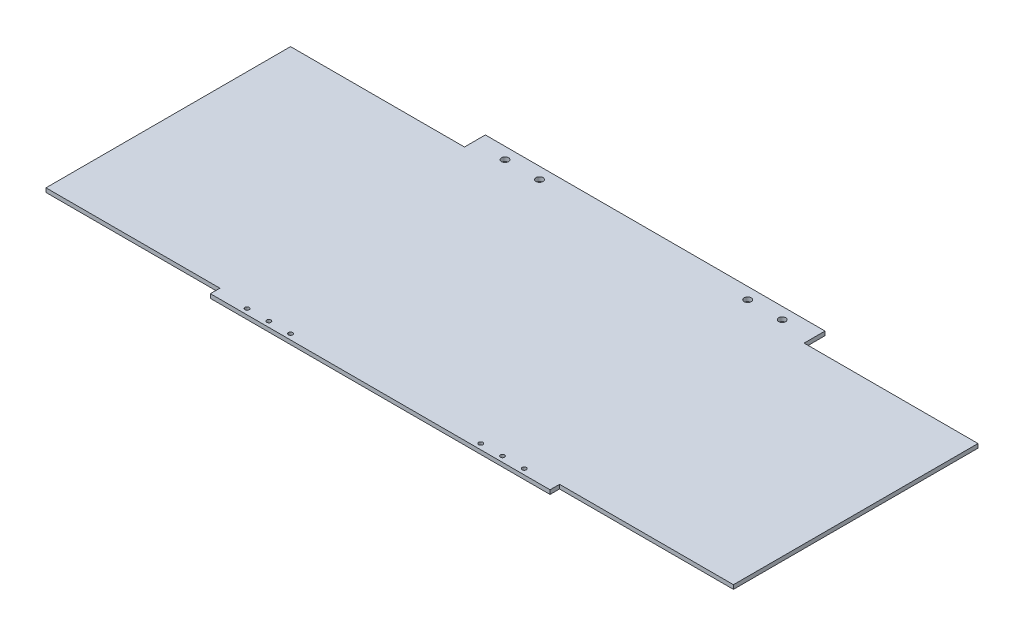
ISO-10303-21;
HEADER;
FILE_DESCRIPTION(('STEP AP214'),'2;1');
FILE_NAME('part.step','',(''),(''),'','','');
FILE_SCHEMA(('AUTOMOTIVE_DESIGN { 1 0 10303 214 1 1 1 1 }'));
ENDSEC;
DATA;
#1=APPLICATION_CONTEXT('core data for automotive mechanical design processes');
#2=APPLICATION_PROTOCOL_DEFINITION('international standard','automotive_design',2000,#1);
#3=PRODUCT_CONTEXT('',#1,'mechanical');
#4=PRODUCT('Part','Part','',(#3));
#5=PRODUCT_RELATED_PRODUCT_CATEGORY('part','',(#4));
#6=PRODUCT_DEFINITION_FORMATION('','',#4);
#7=PRODUCT_DEFINITION_CONTEXT('part definition',#1,'design');
#8=PRODUCT_DEFINITION('design','',#6,#7);
#9=PRODUCT_DEFINITION_SHAPE('','',#8);
#10=(LENGTH_UNIT() NAMED_UNIT(*) SI_UNIT(.MILLI.,.METRE.));
#11=(NAMED_UNIT(*) PLANE_ANGLE_UNIT() SI_UNIT($,.RADIAN.));
#12=(NAMED_UNIT(*) SI_UNIT($,.STERADIAN.) SOLID_ANGLE_UNIT());
#13=UNCERTAINTY_MEASURE_WITH_UNIT(LENGTH_MEASURE(1.E-05),#10,'distance_accuracy_value','');
#14=(GEOMETRIC_REPRESENTATION_CONTEXT(3) GLOBAL_UNCERTAINTY_ASSIGNED_CONTEXT((#13)) GLOBAL_UNIT_ASSIGNED_CONTEXT((#10,
#11,#12)) REPRESENTATION_CONTEXT('',''));
#15=CARTESIAN_POINT('',(0.,0.,0.));
#16=DIRECTION('',(0.,0.,1.));
#17=DIRECTION('',(1.,0.,0.));
#18=AXIS2_PLACEMENT_3D('',#15,#16,#17);
#19=CARTESIAN_POINT('',(0.,3.,0.));
#20=DIRECTION('',(0.,-1.,0.));
#21=DIRECTION('',(0.,0.,-1.));
#22=AXIS2_PLACEMENT_3D('',#19,#20,#21);
#23=PLANE('',#22);
#24=DIRECTION('',(0.,0.,1.));
#25=VECTOR('',#24,1.);
#26=CARTESIAN_POINT('',(0.,3.,0.));
#27=LINE('',#26,#25);
#28=CARTESIAN_POINT('',(0.,3.,-180.));
#29=VERTEX_POINT('',#28);
#30=CARTESIAN_POINT('',(0.,3.,0.));
#31=VERTEX_POINT('',#30);
#32=EDGE_CURVE('E187',#29,#31,#27,.T.);
#33=ORIENTED_EDGE('',*,*,#32,.T.);
#34=DIRECTION('',(1.,0.,0.));
#35=VECTOR('',#34,1.);
#36=CARTESIAN_POINT('',(0.,3.,0.));
#37=LINE('',#36,#35);
#38=CARTESIAN_POINT('',(128.,3.,0.));
#39=VERTEX_POINT('',#38);
#40=EDGE_CURVE('E115',#31,#39,#37,.T.);
#41=ORIENTED_EDGE('',*,*,#40,.T.);
#42=DIRECTION('',(0.,0.,1.));
#43=VECTOR('',#42,1.);
#44=CARTESIAN_POINT('',(128.,3.,0.));
#45=LINE('',#44,#43);
#46=CARTESIAN_POINT('',(128.,3.,7.));
#47=VERTEX_POINT('',#46);
#48=EDGE_CURVE('E214',#39,#47,#45,.T.);
#49=ORIENTED_EDGE('',*,*,#48,.T.);
#50=DIRECTION('',(1.,0.,0.));
#51=VECTOR('',#50,1.);
#52=CARTESIAN_POINT('',(128.,3.,7.));
#53=LINE('',#52,#51);
#54=CARTESIAN_POINT('',(378.,3.,7.));
#55=VERTEX_POINT('',#54);
#56=EDGE_CURVE('E233',#47,#55,#53,.T.);
#57=ORIENTED_EDGE('',*,*,#56,.T.);
#58=DIRECTION('',(0.,0.,-1.));
#59=VECTOR('',#58,1.);
#60=CARTESIAN_POINT('',(378.,3.,7.));
#61=LINE('',#60,#59);
#62=CARTESIAN_POINT('',(378.,3.,0.));
#63=VERTEX_POINT('',#62);
#64=EDGE_CURVE('E230',#55,#63,#61,.T.);
#65=ORIENTED_EDGE('',*,*,#64,.T.);
#66=DIRECTION('',(1.,0.,0.));
#67=VECTOR('',#66,1.);
#68=CARTESIAN_POINT('',(378.,3.,0.));
#69=LINE('',#68,#67);
#70=CARTESIAN_POINT('',(506.,3.,0.));
#71=VERTEX_POINT('',#70);
#72=EDGE_CURVE('E232',#63,#71,#69,.T.);
#73=ORIENTED_EDGE('',*,*,#72,.T.);
#74=DIRECTION('',(0.,0.,-1.));
#75=VECTOR('',#74,1.);
#76=CARTESIAN_POINT('',(506.,3.,0.));
#77=LINE('',#76,#75);
#78=CARTESIAN_POINT('',(506.,3.,-180.));
#79=VERTEX_POINT('',#78);
#80=EDGE_CURVE('E235',#71,#79,#77,.T.);
#81=ORIENTED_EDGE('',*,*,#80,.T.);
#82=DIRECTION('',(-1.,0.,0.));
#83=VECTOR('',#82,1.);
#84=CARTESIAN_POINT('',(378.,3.,-180.));
#85=LINE('',#84,#83);
#86=CARTESIAN_POINT('',(378.,3.,-180.));
#87=VERTEX_POINT('',#86);
#88=EDGE_CURVE('E241',#79,#87,#85,.T.);
#89=ORIENTED_EDGE('',*,*,#88,.T.);
#90=DIRECTION('',(0.,0.,-1.));
#91=VECTOR('',#90,1.);
#92=CARTESIAN_POINT('',(378.,3.,-195.398));
#93=LINE('',#92,#91);
#94=CARTESIAN_POINT('',(378.,3.,-195.398));
#95=VERTEX_POINT('',#94);
#96=EDGE_CURVE('E146',#87,#95,#93,.T.);
#97=ORIENTED_EDGE('',*,*,#96,.T.);
#98=DIRECTION('',(-1.,0.,0.));
#99=VECTOR('',#98,1.);
#100=CARTESIAN_POINT('',(128.,3.,-195.398));
#101=LINE('',#100,#99);
#102=CARTESIAN_POINT('',(128.,3.,-195.398));
#103=VERTEX_POINT('',#102);
#104=EDGE_CURVE('E140',#95,#103,#101,.T.);
#105=ORIENTED_EDGE('',*,*,#104,.T.);
#106=DIRECTION('',(0.,0.,1.));
#107=VECTOR('',#106,1.);
#108=CARTESIAN_POINT('',(128.,3.,-180.));
#109=LINE('',#108,#107);
#110=CARTESIAN_POINT('',(128.,3.,-180.));
#111=VERTEX_POINT('',#110);
#112=EDGE_CURVE('E144',#103,#111,#109,.T.);
#113=ORIENTED_EDGE('',*,*,#112,.T.);
#114=DIRECTION('',(-1.,0.,0.));
#115=VECTOR('',#114,1.);
#116=CARTESIAN_POINT('',(0.,3.,-180.));
#117=LINE('',#116,#115);
#118=EDGE_CURVE('E60',#111,#29,#117,.T.);
#119=ORIENTED_EDGE('',*,*,#118,.T.);
#120=EDGE_LOOP('',(#33,#41,#49,#57,#65,#73,#81,#89,#97,#105,#113,#119));
#121=FACE_BOUND('',#120,.T.);
#122=CARTESIAN_POINT('',(151.,3.,-186.858));
#123=DIRECTION('',(0.,1.,0.));
#124=DIRECTION('',(0.,0.,1.));
#125=AXIS2_PLACEMENT_3D('',#122,#123,#124);
#126=CIRCLE('',#125,2.56400000000002);
#127=CARTESIAN_POINT('',(151.,3.,-184.294));
#128=VERTEX_POINT('',#127);
#129=EDGE_CURVE('E168',#128,#128,#126,.T.);
#130=ORIENTED_EDGE('',*,*,#129,.F.);
#131=EDGE_LOOP('',(#130));
#132=FACE_BOUND('',#131,.T.);
#133=CARTESIAN_POINT('',(176.4,3.,-186.858));
#134=DIRECTION('',(0.,1.,0.));
#135=DIRECTION('',(0.,0.,1.));
#136=AXIS2_PLACEMENT_3D('',#133,#134,#135);
#137=CIRCLE('',#136,2.56400000000002);
#138=CARTESIAN_POINT('',(176.4,3.,-184.294));
#139=VERTEX_POINT('',#138);
#140=EDGE_CURVE('E365',#139,#139,#137,.T.);
#141=ORIENTED_EDGE('',*,*,#140,.F.);
#142=EDGE_LOOP('',(#141));
#143=FACE_BOUND('',#142,.T.);
#144=CARTESIAN_POINT('',(329.6,3.,-186.858));
#145=DIRECTION('',(0.,1.,0.));
#146=DIRECTION('',(0.,0.,-1.));
#147=AXIS2_PLACEMENT_3D('',#144,#145,#146);
#148=CIRCLE('',#147,2.56399999999999);
#149=CARTESIAN_POINT('',(329.6,3.,-189.422));
#150=VERTEX_POINT('',#149);
#151=EDGE_CURVE('E359',#150,#150,#148,.T.);
#152=ORIENTED_EDGE('',*,*,#151,.F.);
#153=EDGE_LOOP('',(#152));
#154=FACE_BOUND('',#153,.T.);
#155=CARTESIAN_POINT('',(355.,3.,-186.858));
#156=DIRECTION('',(0.,1.,0.));
#157=DIRECTION('',(0.,0.,-1.));
#158=AXIS2_PLACEMENT_3D('',#155,#156,#157);
#159=CIRCLE('',#158,2.56399999999999);
#160=CARTESIAN_POINT('',(355.,3.,-189.422));
#161=VERTEX_POINT('',#160);
#162=EDGE_CURVE('E353',#161,#161,#159,.T.);
#163=ORIENTED_EDGE('',*,*,#162,.F.);
#164=EDGE_LOOP('',(#163));
#165=FACE_BOUND('',#164,.T.);
#166=CARTESIAN_POINT('',(151.,3.,3.));
#167=DIRECTION('',(0.,1.,0.));
#168=DIRECTION('',(0.,0.,1.));
#169=AXIS2_PLACEMENT_3D('',#166,#167,#168);
#170=CIRCLE('',#169,1.54000000000001);
#171=CARTESIAN_POINT('',(151.,3.,4.54000000000001));
#172=VERTEX_POINT('',#171);
#173=EDGE_CURVE('E347',#172,#172,#170,.T.);
#174=ORIENTED_EDGE('',*,*,#173,.F.);
#175=EDGE_LOOP('',(#174));
#176=FACE_BOUND('',#175,.T.);
#177=CARTESIAN_POINT('',(183.,3.,3.));
#178=DIRECTION('',(0.,1.,0.));
#179=DIRECTION('',(0.,0.,1.));
#180=AXIS2_PLACEMENT_3D('',#177,#178,#179);
#181=CIRCLE('',#180,1.54000000000001);
#182=CARTESIAN_POINT('',(183.,3.,4.54000000000001));
#183=VERTEX_POINT('',#182);
#184=EDGE_CURVE('E341',#183,#183,#181,.T.);
#185=ORIENTED_EDGE('',*,*,#184,.F.);
#186=EDGE_LOOP('',(#185));
#187=FACE_BOUND('',#186,.T.);
#188=CARTESIAN_POINT('',(167.,3.,3.));
#189=DIRECTION('',(0.,1.,0.));
#190=DIRECTION('',(0.,0.,1.));
#191=AXIS2_PLACEMENT_3D('',#188,#189,#190);
#192=CIRCLE('',#191,1.54000000000001);
#193=CARTESIAN_POINT('',(167.,3.,4.54000000000001));
#194=VERTEX_POINT('',#193);
#195=EDGE_CURVE('E335',#194,#194,#192,.T.);
#196=ORIENTED_EDGE('',*,*,#195,.F.);
#197=EDGE_LOOP('',(#196));
#198=FACE_BOUND('',#197,.T.);
#199=CARTESIAN_POINT('',(323.,3.,3.));
#200=DIRECTION('',(0.,1.,0.));
#201=DIRECTION('',(0.,0.,-1.));
#202=AXIS2_PLACEMENT_3D('',#199,#200,#201);
#203=CIRCLE('',#202,1.54000000000001);
#204=CARTESIAN_POINT('',(323.,3.,1.45999999999999));
#205=VERTEX_POINT('',#204);
#206=EDGE_CURVE('E329',#205,#205,#203,.T.);
#207=ORIENTED_EDGE('',*,*,#206,.F.);
#208=EDGE_LOOP('',(#207));
#209=FACE_BOUND('',#208,.T.);
#210=CARTESIAN_POINT('',(339.,3.,3.));
#211=DIRECTION('',(0.,1.,0.));
#212=DIRECTION('',(0.,0.,-1.));
#213=AXIS2_PLACEMENT_3D('',#210,#211,#212);
#214=CIRCLE('',#213,1.54000000000001);
#215=CARTESIAN_POINT('',(339.,3.,1.45999999999999));
#216=VERTEX_POINT('',#215);
#217=EDGE_CURVE('E323',#216,#216,#214,.T.);
#218=ORIENTED_EDGE('',*,*,#217,.F.);
#219=EDGE_LOOP('',(#218));
#220=FACE_BOUND('',#219,.T.);
#221=CARTESIAN_POINT('',(355.,3.,3.));
#222=DIRECTION('',(0.,1.,0.));
#223=DIRECTION('',(0.,0.,-1.));
#224=AXIS2_PLACEMENT_3D('',#221,#222,#223);
#225=CIRCLE('',#224,1.54000000000001);
#226=CARTESIAN_POINT('',(355.,3.,1.45999999999999));
#227=VERTEX_POINT('',#226);
#228=EDGE_CURVE('E314',#227,#227,#225,.T.);
#229=ORIENTED_EDGE('',*,*,#228,.F.);
#230=EDGE_LOOP('',(#229));
#231=FACE_BOUND('',#230,.T.);
#232=ADVANCED_FACE('F43',(#121,#132,#143,#154,#165,#176,#187,#198,#209,#220,#231),#23,.F.);
#233=CARTESIAN_POINT('',(0.,0.,0.));
#234=DIRECTION('',(0.,-1.,0.));
#235=DIRECTION('',(0.,0.,-1.));
#236=AXIS2_PLACEMENT_3D('',#233,#234,#235);
#237=PLANE('',#236);
#238=CARTESIAN_POINT('',(339.,0.,3.));
#239=DIRECTION('',(0.,1.,0.));
#240=DIRECTION('',(0.,0.,-1.));
#241=AXIS2_PLACEMENT_3D('',#238,#239,#240);
#242=CIRCLE('',#241,1.54000000000001);
#243=CARTESIAN_POINT('',(339.,0.,1.45999999999999));
#244=VERTEX_POINT('',#243);
#245=EDGE_CURVE('E320',#244,#244,#242,.T.);
#246=ORIENTED_EDGE('',*,*,#245,.T.);
#247=EDGE_LOOP('',(#246));
#248=FACE_BOUND('',#247,.T.);
#249=CARTESIAN_POINT('',(167.,0.,3.));
#250=DIRECTION('',(0.,1.,0.));
#251=DIRECTION('',(0.,0.,1.));
#252=AXIS2_PLACEMENT_3D('',#249,#250,#251);
#253=CIRCLE('',#252,1.54000000000001);
#254=CARTESIAN_POINT('',(167.,0.,4.54000000000001));
#255=VERTEX_POINT('',#254);
#256=EDGE_CURVE('E332',#255,#255,#253,.T.);
#257=ORIENTED_EDGE('',*,*,#256,.T.);
#258=EDGE_LOOP('',(#257));
#259=FACE_BOUND('',#258,.T.);
#260=CARTESIAN_POINT('',(151.,0.,3.));
#261=DIRECTION('',(0.,1.,0.));
#262=DIRECTION('',(0.,0.,1.));
#263=AXIS2_PLACEMENT_3D('',#260,#261,#262);
#264=CIRCLE('',#263,1.54000000000001);
#265=CARTESIAN_POINT('',(151.,0.,4.54000000000001));
#266=VERTEX_POINT('',#265);
#267=EDGE_CURVE('E344',#266,#266,#264,.T.);
#268=ORIENTED_EDGE('',*,*,#267,.T.);
#269=EDGE_LOOP('',(#268));
#270=FACE_BOUND('',#269,.T.);
#271=CARTESIAN_POINT('',(329.6,0.,-186.858));
#272=DIRECTION('',(0.,1.,0.));
#273=DIRECTION('',(0.,0.,-1.));
#274=AXIS2_PLACEMENT_3D('',#271,#272,#273);
#275=CIRCLE('',#274,2.56399999999999);
#276=CARTESIAN_POINT('',(329.6,0.,-189.422));
#277=VERTEX_POINT('',#276);
#278=EDGE_CURVE('E356',#277,#277,#275,.T.);
#279=ORIENTED_EDGE('',*,*,#278,.T.);
#280=EDGE_LOOP('',(#279));
#281=FACE_BOUND('',#280,.T.);
#282=CARTESIAN_POINT('',(151.,0.,-186.858));
#283=DIRECTION('',(0.,1.,0.));
#284=DIRECTION('',(0.,0.,1.));
#285=AXIS2_PLACEMENT_3D('',#282,#283,#284);
#286=CIRCLE('',#285,2.56400000000002);
#287=CARTESIAN_POINT('',(151.,0.,-184.294));
#288=VERTEX_POINT('',#287);
#289=EDGE_CURVE('E368',#288,#288,#286,.T.);
#290=ORIENTED_EDGE('',*,*,#289,.T.);
#291=EDGE_LOOP('',(#290));
#292=FACE_BOUND('',#291,.T.);
#293=DIRECTION('',(0.,0.,1.));
#294=VECTOR('',#293,1.);
#295=CARTESIAN_POINT('',(0.,0.,0.));
#296=LINE('',#295,#294);
#297=CARTESIAN_POINT('',(0.,0.,-180.));
#298=VERTEX_POINT('',#297);
#299=CARTESIAN_POINT('',(0.,0.,0.));
#300=VERTEX_POINT('',#299);
#301=EDGE_CURVE('E164',#298,#300,#296,.T.);
#302=ORIENTED_EDGE('',*,*,#301,.F.);
#303=DIRECTION('',(-1.,0.,0.));
#304=VECTOR('',#303,1.);
#305=CARTESIAN_POINT('',(0.,0.,-180.));
#306=LINE('',#305,#304);
#307=CARTESIAN_POINT('',(128.,0.,-180.));
#308=VERTEX_POINT('',#307);
#309=EDGE_CURVE('E107',#308,#298,#306,.T.);
#310=ORIENTED_EDGE('',*,*,#309,.F.);
#311=DIRECTION('',(0.,0.,1.));
#312=VECTOR('',#311,1.);
#313=CARTESIAN_POINT('',(128.,0.,-180.));
#314=LINE('',#313,#312);
#315=CARTESIAN_POINT('',(128.,0.,-195.398));
#316=VERTEX_POINT('',#315);
#317=EDGE_CURVE('E101',#316,#308,#314,.T.);
#318=ORIENTED_EDGE('',*,*,#317,.F.);
#319=DIRECTION('',(-1.,0.,0.));
#320=VECTOR('',#319,1.);
#321=CARTESIAN_POINT('',(128.,0.,-195.398));
#322=LINE('',#321,#320);
#323=CARTESIAN_POINT('',(378.,0.,-195.398));
#324=VERTEX_POINT('',#323);
#325=EDGE_CURVE('E154',#324,#316,#322,.T.);
#326=ORIENTED_EDGE('',*,*,#325,.F.);
#327=DIRECTION('',(0.,0.,-1.));
#328=VECTOR('',#327,1.);
#329=CARTESIAN_POINT('',(378.,0.,-195.398));
#330=LINE('',#329,#328);
#331=CARTESIAN_POINT('',(378.,0.,-180.));
#332=VERTEX_POINT('',#331);
#333=EDGE_CURVE('E182',#332,#324,#330,.T.);
#334=ORIENTED_EDGE('',*,*,#333,.F.);
#335=DIRECTION('',(-1.,0.,0.));
#336=VECTOR('',#335,1.);
#337=CARTESIAN_POINT('',(378.,0.,-180.));
#338=LINE('',#337,#336);
#339=CARTESIAN_POINT('',(506.,0.,-180.));
#340=VERTEX_POINT('',#339);
#341=EDGE_CURVE('E180',#340,#332,#338,.T.);
#342=ORIENTED_EDGE('',*,*,#341,.F.);
#343=DIRECTION('',(0.,0.,-1.));
#344=VECTOR('',#343,1.);
#345=CARTESIAN_POINT('',(506.,0.,0.));
#346=LINE('',#345,#344);
#347=CARTESIAN_POINT('',(506.,0.,0.));
#348=VERTEX_POINT('',#347);
#349=EDGE_CURVE('E178',#348,#340,#346,.T.);
#350=ORIENTED_EDGE('',*,*,#349,.F.);
#351=DIRECTION('',(1.,0.,0.));
#352=VECTOR('',#351,1.);
#353=CARTESIAN_POINT('',(378.,0.,0.));
#354=LINE('',#353,#352);
#355=CARTESIAN_POINT('',(378.,0.,0.));
#356=VERTEX_POINT('',#355);
#357=EDGE_CURVE('E176',#356,#348,#354,.T.);
#358=ORIENTED_EDGE('',*,*,#357,.F.);
#359=DIRECTION('',(0.,0.,-1.));
#360=VECTOR('',#359,1.);
#361=CARTESIAN_POINT('',(378.,0.,7.));
#362=LINE('',#361,#360);
#363=CARTESIAN_POINT('',(378.,0.,7.));
#364=VERTEX_POINT('',#363);
#365=EDGE_CURVE('E174',#364,#356,#362,.T.);
#366=ORIENTED_EDGE('',*,*,#365,.F.);
#367=DIRECTION('',(1.,0.,0.));
#368=VECTOR('',#367,1.);
#369=CARTESIAN_POINT('',(128.,0.,7.));
#370=LINE('',#369,#368);
#371=CARTESIAN_POINT('',(128.,0.,7.));
#372=VERTEX_POINT('',#371);
#373=EDGE_CURVE('E172',#372,#364,#370,.T.);
#374=ORIENTED_EDGE('',*,*,#373,.F.);
#375=DIRECTION('',(0.,0.,1.));
#376=VECTOR('',#375,1.);
#377=CARTESIAN_POINT('',(128.,0.,0.));
#378=LINE('',#377,#376);
#379=CARTESIAN_POINT('',(128.,0.,0.));
#380=VERTEX_POINT('',#379);
#381=EDGE_CURVE('E170',#380,#372,#378,.T.);
#382=ORIENTED_EDGE('',*,*,#381,.F.);
#383=DIRECTION('',(1.,0.,0.));
#384=VECTOR('',#383,1.);
#385=CARTESIAN_POINT('',(0.,0.,0.));
#386=LINE('',#385,#384);
#387=EDGE_CURVE('E167',#300,#380,#386,.T.);
#388=ORIENTED_EDGE('',*,*,#387,.F.);
#389=EDGE_LOOP('',(#302,#310,#318,#326,#334,#342,#350,#358,#366,#374,#382,#388));
#390=FACE_BOUND('',#389,.T.);
#391=CARTESIAN_POINT('',(176.4,0.,-186.858));
#392=DIRECTION('',(0.,1.,0.));
#393=DIRECTION('',(0.,0.,1.));
#394=AXIS2_PLACEMENT_3D('',#391,#392,#393);
#395=CIRCLE('',#394,2.56400000000002);
#396=CARTESIAN_POINT('',(176.4,0.,-184.294));
#397=VERTEX_POINT('',#396);
#398=EDGE_CURVE('E362',#397,#397,#395,.T.);
#399=ORIENTED_EDGE('',*,*,#398,.T.);
#400=EDGE_LOOP('',(#399));
#401=FACE_BOUND('',#400,.T.);
#402=CARTESIAN_POINT('',(355.,0.,-186.858));
#403=DIRECTION('',(0.,1.,0.));
#404=DIRECTION('',(0.,0.,-1.));
#405=AXIS2_PLACEMENT_3D('',#402,#403,#404);
#406=CIRCLE('',#405,2.56399999999999);
#407=CARTESIAN_POINT('',(355.,0.,-189.422));
#408=VERTEX_POINT('',#407);
#409=EDGE_CURVE('E350',#408,#408,#406,.T.);
#410=ORIENTED_EDGE('',*,*,#409,.T.);
#411=EDGE_LOOP('',(#410));
#412=FACE_BOUND('',#411,.T.);
#413=CARTESIAN_POINT('',(183.,0.,3.));
#414=DIRECTION('',(0.,1.,0.));
#415=DIRECTION('',(0.,0.,1.));
#416=AXIS2_PLACEMENT_3D('',#413,#414,#415);
#417=CIRCLE('',#416,1.54000000000001);
#418=CARTESIAN_POINT('',(183.,0.,4.54000000000001));
#419=VERTEX_POINT('',#418);
#420=EDGE_CURVE('E338',#419,#419,#417,.T.);
#421=ORIENTED_EDGE('',*,*,#420,.T.);
#422=EDGE_LOOP('',(#421));
#423=FACE_BOUND('',#422,.T.);
#424=CARTESIAN_POINT('',(323.,0.,3.));
#425=DIRECTION('',(0.,1.,0.));
#426=DIRECTION('',(0.,0.,-1.));
#427=AXIS2_PLACEMENT_3D('',#424,#425,#426);
#428=CIRCLE('',#427,1.54000000000001);
#429=CARTESIAN_POINT('',(323.,0.,1.45999999999999));
#430=VERTEX_POINT('',#429);
#431=EDGE_CURVE('E326',#430,#430,#428,.T.);
#432=ORIENTED_EDGE('',*,*,#431,.T.);
#433=EDGE_LOOP('',(#432));
#434=FACE_BOUND('',#433,.T.);
#435=CARTESIAN_POINT('',(355.,0.,3.));
#436=DIRECTION('',(0.,1.,0.));
#437=DIRECTION('',(0.,0.,-1.));
#438=AXIS2_PLACEMENT_3D('',#435,#436,#437);
#439=CIRCLE('',#438,1.54000000000001);
#440=CARTESIAN_POINT('',(355.,0.,1.45999999999999));
#441=VERTEX_POINT('',#440);
#442=EDGE_CURVE('E317',#441,#441,#439,.T.);
#443=ORIENTED_EDGE('',*,*,#442,.T.);
#444=EDGE_LOOP('',(#443));
#445=FACE_BOUND('',#444,.T.);
#446=ADVANCED_FACE('F218',(#248,#259,#270,#281,#292,#390,#401,#412,#423,#434,#445),#237,.T.);
#447=CARTESIAN_POINT('',(0.,3.,0.));
#448=DIRECTION('',(1.,0.,0.));
#449=DIRECTION('',(0.,0.,-1.));
#450=AXIS2_PLACEMENT_3D('',#447,#448,#449);
#451=PLANE('',#450);
#452=ORIENTED_EDGE('',*,*,#301,.T.);
#453=DIRECTION('',(0.,-1.,0.));
#454=VECTOR('',#453,1.);
#455=CARTESIAN_POINT('',(0.,3.,0.));
#456=LINE('',#455,#454);
#457=EDGE_CURVE('E11',#31,#300,#456,.T.);
#458=ORIENTED_EDGE('',*,*,#457,.F.);
#459=ORIENTED_EDGE('',*,*,#32,.F.);
#460=DIRECTION('',(0.,-1.,0.));
#461=VECTOR('',#460,1.);
#462=CARTESIAN_POINT('',(0.,3.,-180.));
#463=LINE('',#462,#461);
#464=EDGE_CURVE('E160',#29,#298,#463,.T.);
#465=ORIENTED_EDGE('',*,*,#464,.T.);
#466=EDGE_LOOP('',(#452,#458,#459,#465));
#467=FACE_BOUND('',#466,.T.);
#468=ADVANCED_FACE('F45',(#467),#451,.F.);
#469=CARTESIAN_POINT('',(0.,3.,0.));
#470=DIRECTION('',(0.,0.,-1.));
#471=DIRECTION('',(-1.,0.,0.));
#472=AXIS2_PLACEMENT_3D('',#469,#470,#471);
#473=PLANE('',#472);
#474=ORIENTED_EDGE('',*,*,#387,.T.);
#475=DIRECTION('',(0.,-1.,0.));
#476=VECTOR('',#475,1.);
#477=CARTESIAN_POINT('',(128.,3.,0.));
#478=LINE('',#477,#476);
#479=EDGE_CURVE('E52',#39,#380,#478,.T.);
#480=ORIENTED_EDGE('',*,*,#479,.F.);
#481=ORIENTED_EDGE('',*,*,#40,.F.);
#482=ORIENTED_EDGE('',*,*,#457,.T.);
#483=EDGE_LOOP('',(#474,#480,#481,#482));
#484=FACE_BOUND('',#483,.T.);
#485=ADVANCED_FACE('F534',(#484),#473,.F.);
#486=CARTESIAN_POINT('',(128.,3.,0.));
#487=DIRECTION('',(1.,0.,0.));
#488=DIRECTION('',(0.,0.,-1.));
#489=AXIS2_PLACEMENT_3D('',#486,#487,#488);
#490=PLANE('',#489);
#491=ORIENTED_EDGE('',*,*,#381,.T.);
#492=DIRECTION('',(0.,-1.,0.));
#493=VECTOR('',#492,1.);
#494=CARTESIAN_POINT('',(128.,3.,7.));
#495=LINE('',#494,#493);
#496=EDGE_CURVE('E206',#47,#372,#495,.T.);
#497=ORIENTED_EDGE('',*,*,#496,.F.);
#498=ORIENTED_EDGE('',*,*,#48,.F.);
#499=ORIENTED_EDGE('',*,*,#479,.T.);
#500=EDGE_LOOP('',(#491,#497,#498,#499));
#501=FACE_BOUND('',#500,.T.);
#502=ADVANCED_FACE('F212',(#501),#490,.F.);
#503=CARTESIAN_POINT('',(128.,3.,7.));
#504=DIRECTION('',(0.,0.,-1.));
#505=DIRECTION('',(-1.,0.,0.));
#506=AXIS2_PLACEMENT_3D('',#503,#504,#505);
#507=PLANE('',#506);
#508=ORIENTED_EDGE('',*,*,#373,.T.);
#509=DIRECTION('',(0.,-1.,0.));
#510=VECTOR('',#509,1.);
#511=CARTESIAN_POINT('',(378.,3.,7.));
#512=LINE('',#511,#510);
#513=EDGE_CURVE('E203',#55,#364,#512,.T.);
#514=ORIENTED_EDGE('',*,*,#513,.F.);
#515=ORIENTED_EDGE('',*,*,#56,.F.);
#516=ORIENTED_EDGE('',*,*,#496,.T.);
#517=EDGE_LOOP('',(#508,#514,#515,#516));
#518=FACE_BOUND('',#517,.T.);
#519=ADVANCED_FACE('F224',(#518),#507,.F.);
#520=CARTESIAN_POINT('',(378.,3.,7.));
#521=DIRECTION('',(-1.,0.,0.));
#522=DIRECTION('',(0.,0.,1.));
#523=AXIS2_PLACEMENT_3D('',#520,#521,#522);
#524=PLANE('',#523);
#525=ORIENTED_EDGE('',*,*,#365,.T.);
#526=DIRECTION('',(0.,-1.,0.));
#527=VECTOR('',#526,1.);
#528=CARTESIAN_POINT('',(378.,3.,0.));
#529=LINE('',#528,#527);
#530=EDGE_CURVE('E200',#63,#356,#529,.T.);
#531=ORIENTED_EDGE('',*,*,#530,.F.);
#532=ORIENTED_EDGE('',*,*,#64,.F.);
#533=ORIENTED_EDGE('',*,*,#513,.T.);
#534=EDGE_LOOP('',(#525,#531,#532,#533));
#535=FACE_BOUND('',#534,.T.);
#536=ADVANCED_FACE('F228',(#535),#524,.F.);
#537=CARTESIAN_POINT('',(378.,3.,0.));
#538=DIRECTION('',(0.,0.,-1.));
#539=DIRECTION('',(-1.,0.,0.));
#540=AXIS2_PLACEMENT_3D('',#537,#538,#539);
#541=PLANE('',#540);
#542=ORIENTED_EDGE('',*,*,#357,.T.);
#543=DIRECTION('',(0.,-1.,0.));
#544=VECTOR('',#543,1.);
#545=CARTESIAN_POINT('',(506.,3.,0.));
#546=LINE('',#545,#544);
#547=EDGE_CURVE('E197',#71,#348,#546,.T.);
#548=ORIENTED_EDGE('',*,*,#547,.F.);
#549=ORIENTED_EDGE('',*,*,#72,.F.);
#550=ORIENTED_EDGE('',*,*,#530,.T.);
#551=EDGE_LOOP('',(#542,#548,#549,#550));
#552=FACE_BOUND('',#551,.T.);
#553=ADVANCED_FACE('F499',(#552),#541,.F.);
#554=CARTESIAN_POINT('',(506.,3.,0.));
#555=DIRECTION('',(-1.,0.,0.));
#556=DIRECTION('',(0.,0.,1.));
#557=AXIS2_PLACEMENT_3D('',#554,#555,#556);
#558=PLANE('',#557);
#559=ORIENTED_EDGE('',*,*,#349,.T.);
#560=DIRECTION('',(0.,-1.,0.));
#561=VECTOR('',#560,1.);
#562=CARTESIAN_POINT('',(506.,3.,-180.));
#563=LINE('',#562,#561);
#564=EDGE_CURVE('E194',#79,#340,#563,.T.);
#565=ORIENTED_EDGE('',*,*,#564,.F.);
#566=ORIENTED_EDGE('',*,*,#80,.F.);
#567=ORIENTED_EDGE('',*,*,#547,.T.);
#568=EDGE_LOOP('',(#559,#565,#566,#567));
#569=FACE_BOUND('',#568,.T.);
#570=ADVANCED_FACE('F490',(#569),#558,.F.);
#571=CARTESIAN_POINT('',(378.,3.,-180.));
#572=DIRECTION('',(0.,0.,1.));
#573=DIRECTION('',(1.,0.,0.));
#574=AXIS2_PLACEMENT_3D('',#571,#572,#573);
#575=PLANE('',#574);
#576=ORIENTED_EDGE('',*,*,#341,.T.);
#577=DIRECTION('',(0.,-1.,0.));
#578=VECTOR('',#577,1.);
#579=CARTESIAN_POINT('',(378.,3.,-180.));
#580=LINE('',#579,#578);
#581=EDGE_CURVE('E191',#87,#332,#580,.T.);
#582=ORIENTED_EDGE('',*,*,#581,.F.);
#583=ORIENTED_EDGE('',*,*,#88,.F.);
#584=ORIENTED_EDGE('',*,*,#564,.T.);
#585=EDGE_LOOP('',(#576,#582,#583,#584));
#586=FACE_BOUND('',#585,.T.);
#587=ADVANCED_FACE('F247',(#586),#575,.F.);
#588=CARTESIAN_POINT('',(378.,3.,-195.398));
#589=DIRECTION('',(-1.,0.,0.));
#590=DIRECTION('',(0.,0.,1.));
#591=AXIS2_PLACEMENT_3D('',#588,#589,#590);
#592=PLANE('',#591);
#593=ORIENTED_EDGE('',*,*,#333,.T.);
#594=DIRECTION('',(0.,-1.,0.));
#595=VECTOR('',#594,1.);
#596=CARTESIAN_POINT('',(378.,3.,-195.398));
#597=LINE('',#596,#595);
#598=EDGE_CURVE('E155',#95,#324,#597,.T.);
#599=ORIENTED_EDGE('',*,*,#598,.F.);
#600=ORIENTED_EDGE('',*,*,#96,.F.);
#601=ORIENTED_EDGE('',*,*,#581,.T.);
#602=EDGE_LOOP('',(#593,#599,#600,#601));
#603=FACE_BOUND('',#602,.T.);
#604=ADVANCED_FACE('F251',(#603),#592,.F.);
#605=CARTESIAN_POINT('',(128.,3.,-195.398));
#606=DIRECTION('',(0.,0.,1.));
#607=DIRECTION('',(1.,0.,0.));
#608=AXIS2_PLACEMENT_3D('',#605,#606,#607);
#609=PLANE('',#608);
#610=ORIENTED_EDGE('',*,*,#325,.T.);
#611=DIRECTION('',(0.,-1.,0.));
#612=VECTOR('',#611,1.);
#613=CARTESIAN_POINT('',(128.,3.,-195.398));
#614=LINE('',#613,#612);
#615=EDGE_CURVE('E151',#103,#316,#614,.T.);
#616=ORIENTED_EDGE('',*,*,#615,.F.);
#617=ORIENTED_EDGE('',*,*,#104,.F.);
#618=ORIENTED_EDGE('',*,*,#598,.T.);
#619=EDGE_LOOP('',(#610,#616,#617,#618));
#620=FACE_BOUND('',#619,.T.);
#621=ADVANCED_FACE('F152',(#620),#609,.F.);
#622=CARTESIAN_POINT('',(128.,3.,-180.));
#623=DIRECTION('',(1.,0.,0.));
#624=DIRECTION('',(0.,0.,-1.));
#625=AXIS2_PLACEMENT_3D('',#622,#623,#624);
#626=PLANE('',#625);
#627=ORIENTED_EDGE('',*,*,#317,.T.);
#628=DIRECTION('',(0.,-1.,0.));
#629=VECTOR('',#628,1.);
#630=CARTESIAN_POINT('',(128.,3.,-180.));
#631=LINE('',#630,#629);
#632=EDGE_CURVE('E156',#111,#308,#631,.T.);
#633=ORIENTED_EDGE('',*,*,#632,.F.);
#634=ORIENTED_EDGE('',*,*,#112,.F.);
#635=ORIENTED_EDGE('',*,*,#615,.T.);
#636=EDGE_LOOP('',(#627,#633,#634,#635));
#637=FACE_BOUND('',#636,.T.);
#638=ADVANCED_FACE('F158',(#637),#626,.F.);
#639=CARTESIAN_POINT('',(0.,3.,-180.));
#640=DIRECTION('',(0.,0.,1.));
#641=DIRECTION('',(1.,0.,0.));
#642=AXIS2_PLACEMENT_3D('',#639,#640,#641);
#643=PLANE('',#642);
#644=ORIENTED_EDGE('',*,*,#309,.T.);
#645=ORIENTED_EDGE('',*,*,#464,.F.);
#646=ORIENTED_EDGE('',*,*,#118,.F.);
#647=ORIENTED_EDGE('',*,*,#632,.T.);
#648=EDGE_LOOP('',(#644,#645,#646,#647));
#649=FACE_BOUND('',#648,.T.);
#650=ADVANCED_FACE('F255',(#649),#643,.F.);
#651=CARTESIAN_POINT('',(151.,3.,-186.858));
#652=DIRECTION('',(0.,-1.,0.));
#653=DIRECTION('',(0.,0.,-1.));
#654=AXIS2_PLACEMENT_3D('',#651,#652,#653);
#655=CYLINDRICAL_SURFACE('',#654,2.56400000000002);
#656=ORIENTED_EDGE('',*,*,#129,.T.);
#657=EDGE_LOOP('',(#656));
#658=FACE_BOUND('',#657,.T.);
#659=ORIENTED_EDGE('',*,*,#289,.F.);
#660=EDGE_LOOP('',(#659));
#661=FACE_BOUND('',#660,.T.);
#662=ADVANCED_FACE('F257',(#658,#661),#655,.F.);
#663=CARTESIAN_POINT('',(176.4,3.,-186.858));
#664=DIRECTION('',(0.,-1.,0.));
#665=DIRECTION('',(0.,0.,-1.));
#666=AXIS2_PLACEMENT_3D('',#663,#664,#665);
#667=CYLINDRICAL_SURFACE('',#666,2.56400000000002);
#668=ORIENTED_EDGE('',*,*,#140,.T.);
#669=EDGE_LOOP('',(#668));
#670=FACE_BOUND('',#669,.T.);
#671=ORIENTED_EDGE('',*,*,#398,.F.);
#672=EDGE_LOOP('',(#671));
#673=FACE_BOUND('',#672,.T.);
#674=ADVANCED_FACE('F263',(#670,#673),#667,.F.);
#675=CARTESIAN_POINT('',(329.6,3.,-186.858));
#676=DIRECTION('',(0.,-1.,0.));
#677=DIRECTION('',(0.,0.,-1.));
#678=AXIS2_PLACEMENT_3D('',#675,#676,#677);
#679=CYLINDRICAL_SURFACE('',#678,2.56399999999999);
#680=ORIENTED_EDGE('',*,*,#151,.T.);
#681=EDGE_LOOP('',(#680));
#682=FACE_BOUND('',#681,.T.);
#683=ORIENTED_EDGE('',*,*,#278,.F.);
#684=EDGE_LOOP('',(#683));
#685=FACE_BOUND('',#684,.T.);
#686=ADVANCED_FACE('F277',(#682,#685),#679,.F.);
#687=CARTESIAN_POINT('',(355.,3.,-186.858));
#688=DIRECTION('',(0.,-1.,0.));
#689=DIRECTION('',(0.,0.,-1.));
#690=AXIS2_PLACEMENT_3D('',#687,#688,#689);
#691=CYLINDRICAL_SURFACE('',#690,2.56399999999999);
#692=ORIENTED_EDGE('',*,*,#162,.T.);
#693=EDGE_LOOP('',(#692));
#694=FACE_BOUND('',#693,.T.);
#695=ORIENTED_EDGE('',*,*,#409,.F.);
#696=EDGE_LOOP('',(#695));
#697=FACE_BOUND('',#696,.T.);
#698=ADVANCED_FACE('F281',(#694,#697),#691,.F.);
#699=CARTESIAN_POINT('',(151.,3.,3.));
#700=DIRECTION('',(0.,-1.,0.));
#701=DIRECTION('',(0.,0.,-1.));
#702=AXIS2_PLACEMENT_3D('',#699,#700,#701);
#703=CYLINDRICAL_SURFACE('',#702,1.54000000000001);
#704=ORIENTED_EDGE('',*,*,#173,.T.);
#705=EDGE_LOOP('',(#704));
#706=FACE_BOUND('',#705,.T.);
#707=ORIENTED_EDGE('',*,*,#267,.F.);
#708=EDGE_LOOP('',(#707));
#709=FACE_BOUND('',#708,.T.);
#710=ADVANCED_FACE('F285',(#706,#709),#703,.F.);
#711=CARTESIAN_POINT('',(183.,3.,3.));
#712=DIRECTION('',(0.,-1.,0.));
#713=DIRECTION('',(0.,0.,-1.));
#714=AXIS2_PLACEMENT_3D('',#711,#712,#713);
#715=CYLINDRICAL_SURFACE('',#714,1.54000000000001);
#716=ORIENTED_EDGE('',*,*,#184,.T.);
#717=EDGE_LOOP('',(#716));
#718=FACE_BOUND('',#717,.T.);
#719=ORIENTED_EDGE('',*,*,#420,.F.);
#720=EDGE_LOOP('',(#719));
#721=FACE_BOUND('',#720,.T.);
#722=ADVANCED_FACE('F289',(#718,#721),#715,.F.);
#723=CARTESIAN_POINT('',(167.,3.,3.));
#724=DIRECTION('',(0.,-1.,0.));
#725=DIRECTION('',(0.,0.,-1.));
#726=AXIS2_PLACEMENT_3D('',#723,#724,#725);
#727=CYLINDRICAL_SURFACE('',#726,1.54000000000001);
#728=ORIENTED_EDGE('',*,*,#195,.T.);
#729=EDGE_LOOP('',(#728));
#730=FACE_BOUND('',#729,.T.);
#731=ORIENTED_EDGE('',*,*,#256,.F.);
#732=EDGE_LOOP('',(#731));
#733=FACE_BOUND('',#732,.T.);
#734=ADVANCED_FACE('F293',(#730,#733),#727,.F.);
#735=CARTESIAN_POINT('',(323.,3.,3.));
#736=DIRECTION('',(0.,-1.,0.));
#737=DIRECTION('',(0.,0.,-1.));
#738=AXIS2_PLACEMENT_3D('',#735,#736,#737);
#739=CYLINDRICAL_SURFACE('',#738,1.54000000000001);
#740=ORIENTED_EDGE('',*,*,#206,.T.);
#741=EDGE_LOOP('',(#740));
#742=FACE_BOUND('',#741,.T.);
#743=ORIENTED_EDGE('',*,*,#431,.F.);
#744=EDGE_LOOP('',(#743));
#745=FACE_BOUND('',#744,.T.);
#746=ADVANCED_FACE('F297',(#742,#745),#739,.F.);
#747=CARTESIAN_POINT('',(339.,3.,3.));
#748=DIRECTION('',(0.,-1.,0.));
#749=DIRECTION('',(0.,0.,-1.));
#750=AXIS2_PLACEMENT_3D('',#747,#748,#749);
#751=CYLINDRICAL_SURFACE('',#750,1.54000000000001);
#752=ORIENTED_EDGE('',*,*,#217,.T.);
#753=EDGE_LOOP('',(#752));
#754=FACE_BOUND('',#753,.T.);
#755=ORIENTED_EDGE('',*,*,#245,.F.);
#756=EDGE_LOOP('',(#755));
#757=FACE_BOUND('',#756,.T.);
#758=ADVANCED_FACE('F301',(#754,#757),#751,.F.);
#759=CARTESIAN_POINT('',(355.,3.,3.));
#760=DIRECTION('',(0.,-1.,0.));
#761=DIRECTION('',(0.,0.,-1.));
#762=AXIS2_PLACEMENT_3D('',#759,#760,#761);
#763=CYLINDRICAL_SURFACE('',#762,1.54000000000001);
#764=ORIENTED_EDGE('',*,*,#228,.T.);
#765=EDGE_LOOP('',(#764));
#766=FACE_BOUND('',#765,.T.);
#767=ORIENTED_EDGE('',*,*,#442,.F.);
#768=EDGE_LOOP('',(#767));
#769=FACE_BOUND('',#768,.T.);
#770=ADVANCED_FACE('F305',(#766,#769),#763,.F.);
#771=CLOSED_SHELL('',(#232,#446,#468,#485,#502,#519,#536,#553,#570,#587,#604,#621,#638,#650,
#662,#674,#686,#698,#710,#722,#734,#746,#758,#770));
#772=MANIFOLD_SOLID_BREP('B2',#771);
#773=ADVANCED_BREP_SHAPE_REPRESENTATION('',(#18,#772),#14);
#774=SHAPE_DEFINITION_REPRESENTATION(#9,#773);
ENDSEC;
END-ISO-10303-21;
